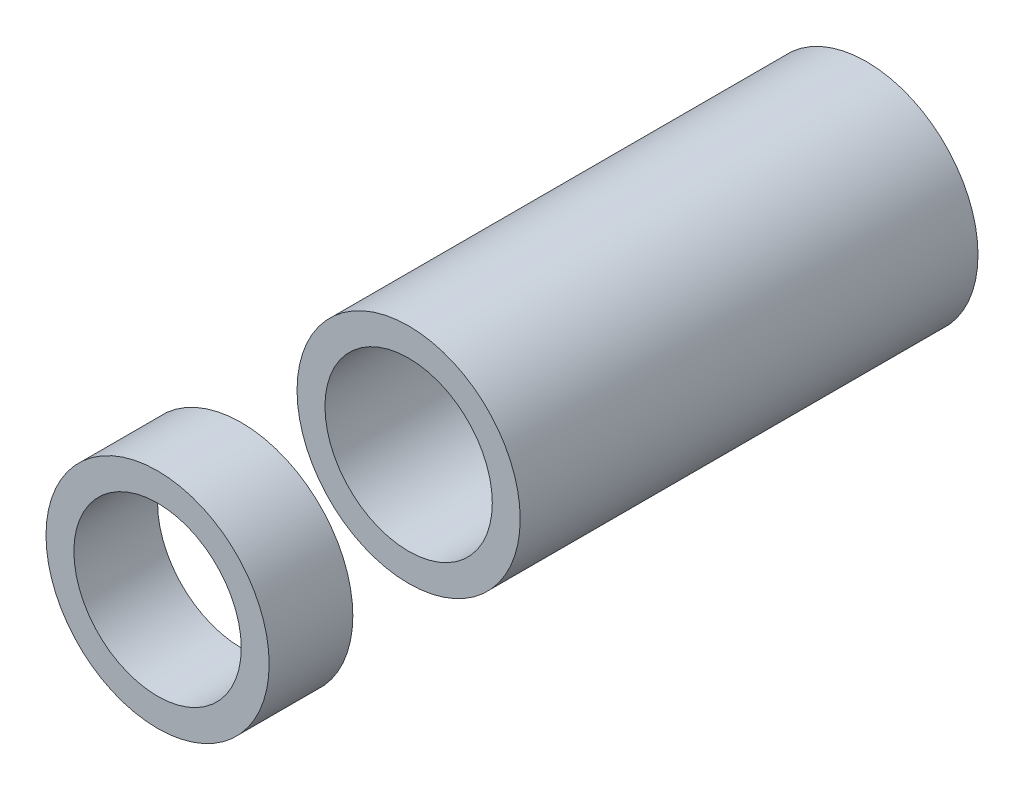
ISO-10303-21;
HEADER;
FILE_DESCRIPTION(('STEP AP214'),'2;1');
FILE_NAME('part.step','',(''),(''),'','','');
FILE_SCHEMA(('AUTOMOTIVE_DESIGN { 1 0 10303 214 1 1 1 1 }'));
ENDSEC;
DATA;
#1=APPLICATION_CONTEXT('core data for automotive mechanical design processes');
#2=APPLICATION_PROTOCOL_DEFINITION('international standard','automotive_design',2000,#1);
#3=PRODUCT_CONTEXT('',#1,'mechanical');
#4=PRODUCT('Part','Part','',(#3));
#5=PRODUCT_RELATED_PRODUCT_CATEGORY('part','',(#4));
#6=PRODUCT_DEFINITION_FORMATION('','',#4);
#7=PRODUCT_DEFINITION_CONTEXT('part definition',#1,'design');
#8=PRODUCT_DEFINITION('design','',#6,#7);
#9=PRODUCT_DEFINITION_SHAPE('','',#8);
#10=(LENGTH_UNIT() NAMED_UNIT(*) SI_UNIT(.MILLI.,.METRE.));
#11=(NAMED_UNIT(*) PLANE_ANGLE_UNIT() SI_UNIT($,.RADIAN.));
#12=(NAMED_UNIT(*) SI_UNIT($,.STERADIAN.) SOLID_ANGLE_UNIT());
#13=UNCERTAINTY_MEASURE_WITH_UNIT(LENGTH_MEASURE(1.E-05),#10,'distance_accuracy_value','');
#14=(GEOMETRIC_REPRESENTATION_CONTEXT(3) GLOBAL_UNCERTAINTY_ASSIGNED_CONTEXT((#13)) GLOBAL_UNIT_ASSIGNED_CONTEXT((#10,
#11,#12)) REPRESENTATION_CONTEXT('',''));
#15=CARTESIAN_POINT('',(0.,0.,0.));
#16=DIRECTION('',(0.,0.,1.));
#17=DIRECTION('',(1.,0.,0.));
#18=AXIS2_PLACEMENT_3D('',#15,#16,#17);
#19=CARTESIAN_POINT('',(0.,6.,44.82608696));
#20=DIRECTION('',(0.,0.,-1.));
#21=DIRECTION('',(1.,0.,0.));
#22=AXIS2_PLACEMENT_3D('',#19,#20,#21);
#23=PLANE('',#22);
#24=CARTESIAN_POINT('',(0.,0.,44.82608696));
#25=DIRECTION('',(0.,0.,-1.));
#26=DIRECTION('',(-1.,0.,0.));
#27=AXIS2_PLACEMENT_3D('',#24,#25,#26);
#28=CIRCLE('',#27,6.);
#29=CARTESIAN_POINT('',(-6.,0.,44.82608696));
#30=VERTEX_POINT('',#29);
#31=EDGE_CURVE('E55',#30,#30,#28,.T.);
#32=ORIENTED_EDGE('',*,*,#31,.F.);
#33=EDGE_LOOP('',(#32));
#34=FACE_BOUND('',#33,.T.);
#35=CARTESIAN_POINT('',(0.,0.,44.82608696));
#36=DIRECTION('',(0.,0.,-1.));
#37=DIRECTION('',(-1.,0.,0.));
#38=AXIS2_PLACEMENT_3D('',#35,#36,#37);
#39=CIRCLE('',#38,8.);
#40=CARTESIAN_POINT('',(-8.,0.,44.82608696));
#41=VERTEX_POINT('',#40);
#42=EDGE_CURVE('E11',#41,#41,#39,.T.);
#43=ORIENTED_EDGE('',*,*,#42,.T.);
#44=EDGE_LOOP('',(#43));
#45=FACE_BOUND('',#44,.T.);
#46=ADVANCED_FACE('F41',(#34,#45),#23,.T.);
#47=CARTESIAN_POINT('',(0.,0.,26.3478260869565));
#48=DIRECTION('',(0.,0.,1.));
#49=DIRECTION('',(-1.,0.,0.));
#50=AXIS2_PLACEMENT_3D('',#47,#48,#49);
#51=CYLINDRICAL_SURFACE('',#50,8.);
#52=ORIENTED_EDGE('',*,*,#42,.F.);
#53=EDGE_LOOP('',(#52));
#54=FACE_BOUND('',#53,.T.);
#55=CARTESIAN_POINT('',(0.,0.,50.82608696));
#56=DIRECTION('',(0.,0.,-1.));
#57=DIRECTION('',(-1.,0.,0.));
#58=AXIS2_PLACEMENT_3D('',#55,#56,#57);
#59=CIRCLE('',#58,8.);
#60=CARTESIAN_POINT('',(-8.,0.,50.82608696));
#61=VERTEX_POINT('',#60);
#62=EDGE_CURVE('E47',#61,#61,#59,.T.);
#63=ORIENTED_EDGE('',*,*,#62,.T.);
#64=EDGE_LOOP('',(#63));
#65=FACE_BOUND('',#64,.T.);
#66=ADVANCED_FACE('F64',(#54,#65),#51,.T.);
#67=CARTESIAN_POINT('',(0.,8.,50.82608696));
#68=DIRECTION('',(0.,0.,1.));
#69=DIRECTION('',(-1.,0.,0.));
#70=AXIS2_PLACEMENT_3D('',#67,#68,#69);
#71=PLANE('',#70);
#72=ORIENTED_EDGE('',*,*,#62,.F.);
#73=EDGE_LOOP('',(#72));
#74=FACE_BOUND('',#73,.T.);
#75=CARTESIAN_POINT('',(0.,0.,50.82608696));
#76=DIRECTION('',(0.,0.,-1.));
#77=DIRECTION('',(-1.,0.,0.));
#78=AXIS2_PLACEMENT_3D('',#75,#76,#77);
#79=CIRCLE('',#78,6.);
#80=CARTESIAN_POINT('',(-6.,0.,50.82608696));
#81=VERTEX_POINT('',#80);
#82=EDGE_CURVE('E51',#81,#81,#79,.T.);
#83=ORIENTED_EDGE('',*,*,#82,.T.);
#84=EDGE_LOOP('',(#83));
#85=FACE_BOUND('',#84,.T.);
#86=ADVANCED_FACE('F68',(#74,#85),#71,.T.);
#87=CARTESIAN_POINT('',(0.,0.,26.3478260869565));
#88=DIRECTION('',(0.,0.,1.));
#89=DIRECTION('',(-1.,0.,0.));
#90=AXIS2_PLACEMENT_3D('',#87,#88,#89);
#91=CYLINDRICAL_SURFACE('',#90,6.);
#92=ORIENTED_EDGE('',*,*,#82,.F.);
#93=EDGE_LOOP('',(#92));
#94=FACE_BOUND('',#93,.T.);
#95=ORIENTED_EDGE('',*,*,#31,.T.);
#96=EDGE_LOOP('',(#95));
#97=FACE_BOUND('',#96,.T.);
#98=ADVANCED_FACE('F61',(#94,#97),#91,.F.);
#99=CLOSED_SHELL('',(#46,#66,#86,#98));
#100=MANIFOLD_SOLID_BREP('B2',#99);
#101=CARTESIAN_POINT('',(0.,6.,0.));
#102=DIRECTION('',(0.,0.,-1.));
#103=DIRECTION('',(1.,0.,0.));
#104=AXIS2_PLACEMENT_3D('',#101,#102,#103);
#105=PLANE('',#104);
#106=CARTESIAN_POINT('',(0.,0.,0.));
#107=DIRECTION('',(0.,0.,-1.));
#108=DIRECTION('',(-1.,0.,0.));
#109=AXIS2_PLACEMENT_3D('',#106,#107,#108);
#110=CIRCLE('',#109,6.);
#111=CARTESIAN_POINT('',(-6.,0.,0.));
#112=VERTEX_POINT('',#111);
#113=EDGE_CURVE('E117',#112,#112,#110,.T.);
#114=ORIENTED_EDGE('',*,*,#113,.F.);
#115=EDGE_LOOP('',(#114));
#116=FACE_BOUND('',#115,.T.);
#117=CARTESIAN_POINT('',(0.,0.,0.));
#118=DIRECTION('',(0.,0.,-1.));
#119=DIRECTION('',(-1.,0.,0.));
#120=AXIS2_PLACEMENT_3D('',#117,#118,#119);
#121=CIRCLE('',#120,8.);
#122=CARTESIAN_POINT('',(-8.,0.,0.));
#123=VERTEX_POINT('',#122);
#124=EDGE_CURVE('E40',#123,#123,#121,.T.);
#125=ORIENTED_EDGE('',*,*,#124,.T.);
#126=EDGE_LOOP('',(#125));
#127=FACE_BOUND('',#126,.T.);
#128=ADVANCED_FACE('F103',(#116,#127),#105,.T.);
#129=CARTESIAN_POINT('',(0.,0.,26.3478260869565));
#130=DIRECTION('',(0.,0.,1.));
#131=DIRECTION('',(-1.,0.,0.));
#132=AXIS2_PLACEMENT_3D('',#129,#130,#131);
#133=CYLINDRICAL_SURFACE('',#132,8.);
#134=ORIENTED_EDGE('',*,*,#124,.F.);
#135=EDGE_LOOP('',(#134));
#136=FACE_BOUND('',#135,.T.);
#137=CARTESIAN_POINT('',(0.,0.,32.82608696));
#138=DIRECTION('',(0.,0.,-1.));
#139=DIRECTION('',(-1.,0.,0.));
#140=AXIS2_PLACEMENT_3D('',#137,#138,#139);
#141=CIRCLE('',#140,8.);
#142=CARTESIAN_POINT('',(-8.,0.,32.82608696));
#143=VERTEX_POINT('',#142);
#144=EDGE_CURVE('E109',#143,#143,#141,.T.);
#145=ORIENTED_EDGE('',*,*,#144,.T.);
#146=EDGE_LOOP('',(#145));
#147=FACE_BOUND('',#146,.T.);
#148=ADVANCED_FACE('F126',(#136,#147),#133,.T.);
#149=CARTESIAN_POINT('',(0.,8.,32.82608696));
#150=DIRECTION('',(0.,0.,1.));
#151=DIRECTION('',(-1.,0.,0.));
#152=AXIS2_PLACEMENT_3D('',#149,#150,#151);
#153=PLANE('',#152);
#154=ORIENTED_EDGE('',*,*,#144,.F.);
#155=EDGE_LOOP('',(#154));
#156=FACE_BOUND('',#155,.T.);
#157=CARTESIAN_POINT('',(0.,0.,32.82608696));
#158=DIRECTION('',(0.,0.,-1.));
#159=DIRECTION('',(-1.,0.,0.));
#160=AXIS2_PLACEMENT_3D('',#157,#158,#159);
#161=CIRCLE('',#160,6.);
#162=CARTESIAN_POINT('',(-6.,0.,32.82608696));
#163=VERTEX_POINT('',#162);
#164=EDGE_CURVE('E113',#163,#163,#161,.T.);
#165=ORIENTED_EDGE('',*,*,#164,.T.);
#166=EDGE_LOOP('',(#165));
#167=FACE_BOUND('',#166,.T.);
#168=ADVANCED_FACE('F130',(#156,#167),#153,.T.);
#169=CARTESIAN_POINT('',(0.,0.,26.3478260869565));
#170=DIRECTION('',(0.,0.,1.));
#171=DIRECTION('',(-1.,0.,0.));
#172=AXIS2_PLACEMENT_3D('',#169,#170,#171);
#173=CYLINDRICAL_SURFACE('',#172,6.);
#174=ORIENTED_EDGE('',*,*,#164,.F.);
#175=EDGE_LOOP('',(#174));
#176=FACE_BOUND('',#175,.T.);
#177=ORIENTED_EDGE('',*,*,#113,.T.);
#178=EDGE_LOOP('',(#177));
#179=FACE_BOUND('',#178,.T.);
#180=ADVANCED_FACE('F123',(#176,#179),#173,.F.);
#181=CLOSED_SHELL('',(#128,#148,#168,#180));
#182=MANIFOLD_SOLID_BREP('B6',#181);
#183=ADVANCED_BREP_SHAPE_REPRESENTATION('',(#18,#100,#182),#14);
#184=SHAPE_DEFINITION_REPRESENTATION(#9,#183);
ENDSEC;
END-ISO-10303-21;
